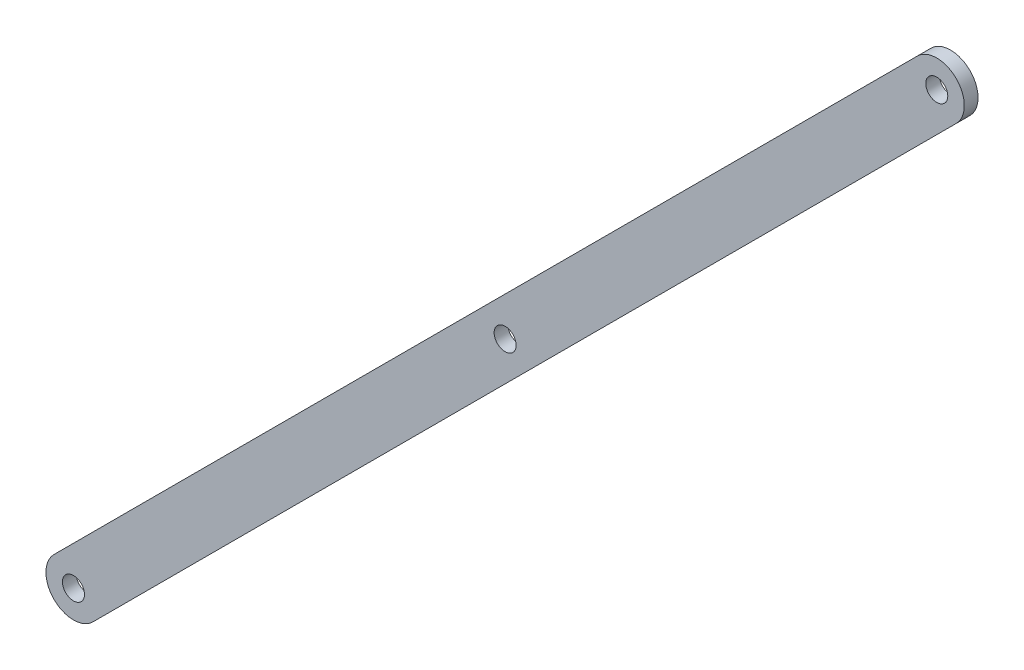
ISO-10303-21;
HEADER;
FILE_DESCRIPTION(('STEP AP214'),'2;1');
FILE_NAME('part.step','',(''),(''),'','','');
FILE_SCHEMA(('AUTOMOTIVE_DESIGN { 1 0 10303 214 1 1 1 1 }'));
ENDSEC;
DATA;
#1=APPLICATION_CONTEXT('core data for automotive mechanical design processes');
#2=APPLICATION_PROTOCOL_DEFINITION('international standard','automotive_design',2000,#1);
#3=PRODUCT_CONTEXT('',#1,'mechanical');
#4=PRODUCT('Part','Part','',(#3));
#5=PRODUCT_RELATED_PRODUCT_CATEGORY('part','',(#4));
#6=PRODUCT_DEFINITION_FORMATION('','',#4);
#7=PRODUCT_DEFINITION_CONTEXT('part definition',#1,'design');
#8=PRODUCT_DEFINITION('design','',#6,#7);
#9=PRODUCT_DEFINITION_SHAPE('','',#8);
#10=(LENGTH_UNIT() NAMED_UNIT(*) SI_UNIT(.MILLI.,.METRE.));
#11=(NAMED_UNIT(*) PLANE_ANGLE_UNIT() SI_UNIT($,.RADIAN.));
#12=(NAMED_UNIT(*) SI_UNIT($,.STERADIAN.) SOLID_ANGLE_UNIT());
#13=UNCERTAINTY_MEASURE_WITH_UNIT(LENGTH_MEASURE(1.E-05),#10,'distance_accuracy_value','');
#14=(GEOMETRIC_REPRESENTATION_CONTEXT(3) GLOBAL_UNCERTAINTY_ASSIGNED_CONTEXT((#13)) GLOBAL_UNIT_ASSIGNED_CONTEXT((#10,
#11,#12)) REPRESENTATION_CONTEXT('',''));
#15=CARTESIAN_POINT('',(0.,0.,0.));
#16=DIRECTION('',(0.,0.,1.));
#17=DIRECTION('',(1.,0.,0.));
#18=AXIS2_PLACEMENT_3D('',#15,#16,#17);
#19=CARTESIAN_POINT('',(0.,0.,5.));
#20=DIRECTION('',(0.,0.,1.));
#21=DIRECTION('',(1.,0.,0.));
#22=AXIS2_PLACEMENT_3D('',#19,#20,#21);
#23=PLANE('',#22);
#24=CARTESIAN_POINT('',(313.672568134352,313.672568134353,5.));
#25=DIRECTION('',(0.,0.,1.));
#26=DIRECTION('',(1.,0.,0.));
#27=AXIS2_PLACEMENT_3D('',#24,#25,#26);
#28=CIRCLE('',#27,3.99999999999999);
#29=CARTESIAN_POINT('',(317.672568134352,313.672568134353,5.));
#30=VERTEX_POINT('',#29);
#31=EDGE_CURVE('E140',#30,#30,#28,.T.);
#32=ORIENTED_EDGE('',*,*,#31,.F.);
#33=EDGE_LOOP('',(#32));
#34=FACE_BOUND('',#33,.T.);
#35=CARTESIAN_POINT('',(0.,0.,5.));
#36=DIRECTION('',(0.,0.,1.));
#37=DIRECTION('',(1.,0.,0.));
#38=AXIS2_PLACEMENT_3D('',#35,#36,#37);
#39=CIRCLE('',#38,10.);
#40=CARTESIAN_POINT('',(-7.07106781186549,7.07106781186546,5.));
#41=VERTEX_POINT('',#40);
#42=CARTESIAN_POINT('',(7.07106781186549,-7.07106781186546,5.));
#43=VERTEX_POINT('',#42);
#44=EDGE_CURVE('E98',#41,#43,#39,.T.);
#45=ORIENTED_EDGE('',*,*,#44,.T.);
#46=DIRECTION('',(0.707106781186546,0.707106781186549,0.));
#47=VECTOR('',#46,1.);
#48=CARTESIAN_POINT('',(7.07106781186549,-7.07106781186546,5.));
#49=LINE('',#48,#47);
#50=CARTESIAN_POINT('',(320.743635946217,306.601500322488,5.));
#51=VERTEX_POINT('',#50);
#52=EDGE_CURVE('E93',#43,#51,#49,.T.);
#53=ORIENTED_EDGE('',*,*,#52,.T.);
#54=CARTESIAN_POINT('',(313.672568134352,313.672568134353,5.));
#55=DIRECTION('',(0.,0.,1.));
#56=DIRECTION('',(1.,0.,0.));
#57=AXIS2_PLACEMENT_3D('',#54,#55,#56);
#58=CIRCLE('',#57,10.);
#59=CARTESIAN_POINT('',(306.601500322486,320.743635946219,5.));
#60=VERTEX_POINT('',#59);
#61=EDGE_CURVE('E96',#51,#60,#58,.T.);
#62=ORIENTED_EDGE('',*,*,#61,.T.);
#63=DIRECTION('',(-0.707106781186546,-0.707106781186549,0.));
#64=VECTOR('',#63,1.);
#65=CARTESIAN_POINT('',(-7.07106781186549,7.07106781186546,5.));
#66=LINE('',#65,#64);
#67=EDGE_CURVE('E63',#60,#41,#66,.T.);
#68=ORIENTED_EDGE('',*,*,#67,.T.);
#69=EDGE_LOOP('',(#45,#53,#62,#68));
#70=FACE_BOUND('',#69,.T.);
#71=CARTESIAN_POINT('',(0.,0.,5.));
#72=DIRECTION('',(0.,0.,1.));
#73=DIRECTION('',(1.,0.,0.));
#74=AXIS2_PLACEMENT_3D('',#71,#72,#73);
#75=CIRCLE('',#74,4.);
#76=CARTESIAN_POINT('',(4.,0.,5.));
#77=VERTEX_POINT('',#76);
#78=EDGE_CURVE('E118',#77,#77,#75,.T.);
#79=ORIENTED_EDGE('',*,*,#78,.F.);
#80=EDGE_LOOP('',(#79));
#81=FACE_BOUND('',#80,.T.);
#82=CARTESIAN_POINT('',(156.836284067176,156.836284067177,5.));
#83=DIRECTION('',(0.,0.,1.));
#84=DIRECTION('',(1.,0.,0.));
#85=AXIS2_PLACEMENT_3D('',#82,#83,#84);
#86=CIRCLE('',#85,3.99999999999999);
#87=CARTESIAN_POINT('',(160.836284067176,156.836284067177,5.));
#88=VERTEX_POINT('',#87);
#89=EDGE_CURVE('E148',#88,#88,#86,.T.);
#90=ORIENTED_EDGE('',*,*,#89,.F.);
#91=EDGE_LOOP('',(#90));
#92=FACE_BOUND('',#91,.T.);
#93=ADVANCED_FACE('F45',(#34,#70,#81,#92),#23,.T.);
#94=CARTESIAN_POINT('',(0.,0.,0.));
#95=DIRECTION('',(0.,0.,1.));
#96=DIRECTION('',(1.,0.,0.));
#97=AXIS2_PLACEMENT_3D('',#94,#95,#96);
#98=PLANE('',#97);
#99=CARTESIAN_POINT('',(0.,0.,0.));
#100=DIRECTION('',(0.,0.,1.));
#101=DIRECTION('',(1.,0.,0.));
#102=AXIS2_PLACEMENT_3D('',#99,#100,#101);
#103=CIRCLE('',#102,10.);
#104=CARTESIAN_POINT('',(-7.07106781186549,7.07106781186546,0.));
#105=VERTEX_POINT('',#104);
#106=CARTESIAN_POINT('',(7.07106781186549,-7.07106781186546,0.));
#107=VERTEX_POINT('',#106);
#108=EDGE_CURVE('E114',#105,#107,#103,.T.);
#109=ORIENTED_EDGE('',*,*,#108,.F.);
#110=DIRECTION('',(-0.707106781186546,-0.707106781186549,0.));
#111=VECTOR('',#110,1.);
#112=CARTESIAN_POINT('',(-7.07106781186549,7.07106781186546,0.));
#113=LINE('',#112,#111);
#114=CARTESIAN_POINT('',(306.601500322486,320.743635946219,0.));
#115=VERTEX_POINT('',#114);
#116=EDGE_CURVE('E86',#115,#105,#113,.T.);
#117=ORIENTED_EDGE('',*,*,#116,.F.);
#118=CARTESIAN_POINT('',(313.672568134352,313.672568134353,0.));
#119=DIRECTION('',(0.,0.,1.));
#120=DIRECTION('',(1.,0.,0.));
#121=AXIS2_PLACEMENT_3D('',#118,#119,#120);
#122=CIRCLE('',#121,10.);
#123=CARTESIAN_POINT('',(320.743635946217,306.601500322488,0.));
#124=VERTEX_POINT('',#123);
#125=EDGE_CURVE('E80',#124,#115,#122,.T.);
#126=ORIENTED_EDGE('',*,*,#125,.F.);
#127=DIRECTION('',(0.707106781186546,0.707106781186549,0.));
#128=VECTOR('',#127,1.);
#129=CARTESIAN_POINT('',(7.07106781186549,-7.07106781186546,0.));
#130=LINE('',#129,#128);
#131=EDGE_CURVE('E103',#107,#124,#130,.T.);
#132=ORIENTED_EDGE('',*,*,#131,.F.);
#133=EDGE_LOOP('',(#109,#117,#126,#132));
#134=FACE_BOUND('',#133,.T.);
#135=CARTESIAN_POINT('',(0.,0.,0.));
#136=DIRECTION('',(0.,0.,1.));
#137=DIRECTION('',(1.,0.,0.));
#138=AXIS2_PLACEMENT_3D('',#135,#136,#137);
#139=CIRCLE('',#138,4.);
#140=CARTESIAN_POINT('',(4.,0.,0.));
#141=VERTEX_POINT('',#140);
#142=EDGE_CURVE('E136',#141,#141,#139,.T.);
#143=ORIENTED_EDGE('',*,*,#142,.T.);
#144=EDGE_LOOP('',(#143));
#145=FACE_BOUND('',#144,.T.);
#146=CARTESIAN_POINT('',(313.672568134352,313.672568134353,0.));
#147=DIRECTION('',(0.,0.,1.));
#148=DIRECTION('',(1.,0.,0.));
#149=AXIS2_PLACEMENT_3D('',#146,#147,#148);
#150=CIRCLE('',#149,3.99999999999999);
#151=CARTESIAN_POINT('',(317.672568134352,313.672568134353,0.));
#152=VERTEX_POINT('',#151);
#153=EDGE_CURVE('E144',#152,#152,#150,.T.);
#154=ORIENTED_EDGE('',*,*,#153,.T.);
#155=EDGE_LOOP('',(#154));
#156=FACE_BOUND('',#155,.T.);
#157=CARTESIAN_POINT('',(156.836284067176,156.836284067177,0.));
#158=DIRECTION('',(0.,0.,1.));
#159=DIRECTION('',(1.,0.,0.));
#160=AXIS2_PLACEMENT_3D('',#157,#158,#159);
#161=CIRCLE('',#160,3.99999999999999);
#162=CARTESIAN_POINT('',(160.836284067176,156.836284067177,0.));
#163=VERTEX_POINT('',#162);
#164=EDGE_CURVE('E152',#163,#163,#161,.T.);
#165=ORIENTED_EDGE('',*,*,#164,.T.);
#166=EDGE_LOOP('',(#165));
#167=FACE_BOUND('',#166,.T.);
#168=ADVANCED_FACE('F131',(#134,#145,#156,#167),#98,.F.);
#169=CARTESIAN_POINT('',(0.,0.,5.));
#170=DIRECTION('',(0.,0.,-1.));
#171=DIRECTION('',(-1.,0.,0.));
#172=AXIS2_PLACEMENT_3D('',#169,#170,#171);
#173=CYLINDRICAL_SURFACE('',#172,10.);
#174=ORIENTED_EDGE('',*,*,#108,.T.);
#175=DIRECTION('',(0.,0.,-1.));
#176=VECTOR('',#175,1.);
#177=CARTESIAN_POINT('',(7.07106781186549,-7.07106781186546,5.));
#178=LINE('',#177,#176);
#179=EDGE_CURVE('E11',#43,#107,#178,.T.);
#180=ORIENTED_EDGE('',*,*,#179,.F.);
#181=ORIENTED_EDGE('',*,*,#44,.F.);
#182=DIRECTION('',(0.,0.,-1.));
#183=VECTOR('',#182,1.);
#184=CARTESIAN_POINT('',(-7.07106781186549,7.07106781186546,5.));
#185=LINE('',#184,#183);
#186=EDGE_CURVE('E110',#41,#105,#185,.T.);
#187=ORIENTED_EDGE('',*,*,#186,.T.);
#188=EDGE_LOOP('',(#174,#180,#181,#187));
#189=FACE_BOUND('',#188,.T.);
#190=ADVANCED_FACE('F47',(#189),#173,.T.);
#191=CARTESIAN_POINT('',(7.07106781186549,-7.07106781186546,5.));
#192=DIRECTION('',(-0.707106781186549,0.707106781186546,0.));
#193=DIRECTION('',(-0.707106781186546,-0.707106781186549,0.));
#194=AXIS2_PLACEMENT_3D('',#191,#192,#193);
#195=PLANE('',#194);
#196=ORIENTED_EDGE('',*,*,#131,.T.);
#197=DIRECTION('',(0.,0.,-1.));
#198=VECTOR('',#197,1.);
#199=CARTESIAN_POINT('',(320.743635946217,306.601500322488,5.));
#200=LINE('',#199,#198);
#201=EDGE_CURVE('E55',#51,#124,#200,.T.);
#202=ORIENTED_EDGE('',*,*,#201,.F.);
#203=ORIENTED_EDGE('',*,*,#52,.F.);
#204=ORIENTED_EDGE('',*,*,#179,.T.);
#205=EDGE_LOOP('',(#196,#202,#203,#204));
#206=FACE_BOUND('',#205,.T.);
#207=ADVANCED_FACE('F102',(#206),#195,.F.);
#208=CARTESIAN_POINT('',(313.672568134352,313.672568134353,5.));
#209=DIRECTION('',(0.,0.,-1.));
#210=DIRECTION('',(-1.,0.,0.));
#211=AXIS2_PLACEMENT_3D('',#208,#209,#210);
#212=CYLINDRICAL_SURFACE('',#211,10.);
#213=ORIENTED_EDGE('',*,*,#125,.T.);
#214=DIRECTION('',(0.,0.,-1.));
#215=VECTOR('',#214,1.);
#216=CARTESIAN_POINT('',(306.601500322486,320.743635946219,5.));
#217=LINE('',#216,#215);
#218=EDGE_CURVE('E105',#60,#115,#217,.T.);
#219=ORIENTED_EDGE('',*,*,#218,.F.);
#220=ORIENTED_EDGE('',*,*,#61,.F.);
#221=ORIENTED_EDGE('',*,*,#201,.T.);
#222=EDGE_LOOP('',(#213,#219,#220,#221));
#223=FACE_BOUND('',#222,.T.);
#224=ADVANCED_FACE('F106',(#223),#212,.T.);
#225=CARTESIAN_POINT('',(-7.07106781186549,7.07106781186546,5.));
#226=DIRECTION('',(0.707106781186549,-0.707106781186546,0.));
#227=DIRECTION('',(0.707106781186546,0.707106781186549,0.));
#228=AXIS2_PLACEMENT_3D('',#225,#226,#227);
#229=PLANE('',#228);
#230=ORIENTED_EDGE('',*,*,#116,.T.);
#231=ORIENTED_EDGE('',*,*,#186,.F.);
#232=ORIENTED_EDGE('',*,*,#67,.F.);
#233=ORIENTED_EDGE('',*,*,#218,.T.);
#234=EDGE_LOOP('',(#230,#231,#232,#233));
#235=FACE_BOUND('',#234,.T.);
#236=ADVANCED_FACE('F128',(#235),#229,.F.);
#237=CARTESIAN_POINT('',(0.,0.,5.));
#238=DIRECTION('',(0.,0.,-1.));
#239=DIRECTION('',(-1.,0.,0.));
#240=AXIS2_PLACEMENT_3D('',#237,#238,#239);
#241=CYLINDRICAL_SURFACE('',#240,4.);
#242=ORIENTED_EDGE('',*,*,#78,.T.);
#243=EDGE_LOOP('',(#242));
#244=FACE_BOUND('',#243,.T.);
#245=ORIENTED_EDGE('',*,*,#142,.F.);
#246=EDGE_LOOP('',(#245));
#247=FACE_BOUND('',#246,.T.);
#248=ADVANCED_FACE('F172',(#244,#247),#241,.F.);
#249=CARTESIAN_POINT('',(313.672568134352,313.672568134353,5.));
#250=DIRECTION('',(0.,0.,-1.));
#251=DIRECTION('',(-1.,0.,0.));
#252=AXIS2_PLACEMENT_3D('',#249,#250,#251);
#253=CYLINDRICAL_SURFACE('',#252,3.99999999999999);
#254=ORIENTED_EDGE('',*,*,#31,.T.);
#255=EDGE_LOOP('',(#254));
#256=FACE_BOUND('',#255,.T.);
#257=ORIENTED_EDGE('',*,*,#153,.F.);
#258=EDGE_LOOP('',(#257));
#259=FACE_BOUND('',#258,.T.);
#260=ADVANCED_FACE('F240',(#256,#259),#253,.F.);
#261=CARTESIAN_POINT('',(156.836284067176,156.836284067177,5.));
#262=DIRECTION('',(0.,0.,-1.));
#263=DIRECTION('',(-1.,0.,0.));
#264=AXIS2_PLACEMENT_3D('',#261,#262,#263);
#265=CYLINDRICAL_SURFACE('',#264,3.99999999999999);
#266=ORIENTED_EDGE('',*,*,#89,.T.);
#267=EDGE_LOOP('',(#266));
#268=FACE_BOUND('',#267,.T.);
#269=ORIENTED_EDGE('',*,*,#164,.F.);
#270=EDGE_LOOP('',(#269));
#271=FACE_BOUND('',#270,.T.);
#272=ADVANCED_FACE('F160',(#268,#271),#265,.F.);
#273=CLOSED_SHELL('',(#93,#168,#190,#207,#224,#236,#248,#260,#272));
#274=MANIFOLD_SOLID_BREP('B2',#273);
#275=ADVANCED_BREP_SHAPE_REPRESENTATION('',(#18,#274),#14);
#276=SHAPE_DEFINITION_REPRESENTATION(#9,#275);
ENDSEC;
END-ISO-10303-21;
